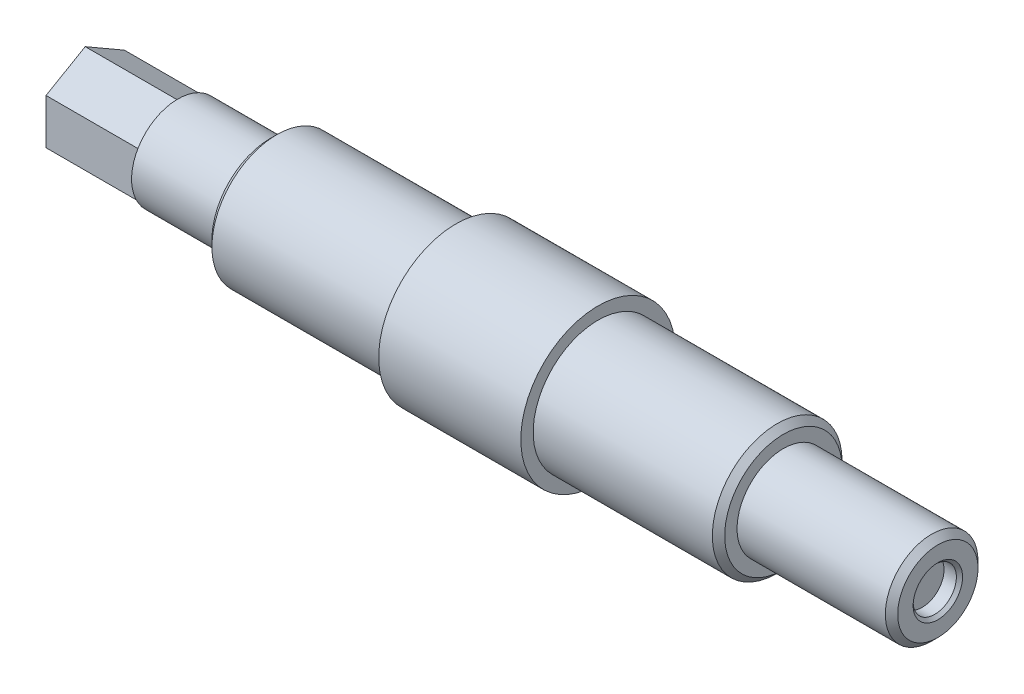
ISO-10303-21;
HEADER;
FILE_DESCRIPTION(('STEP AP214'),'2;1');
FILE_NAME('part.step','',(''),(''),'','','');
FILE_SCHEMA(('AUTOMOTIVE_DESIGN { 1 0 10303 214 1 1 1 1 }'));
ENDSEC;
DATA;
#1=APPLICATION_CONTEXT('core data for automotive mechanical design processes');
#2=APPLICATION_PROTOCOL_DEFINITION('international standard','automotive_design',2000,#1);
#3=PRODUCT_CONTEXT('',#1,'mechanical');
#4=PRODUCT('Part','Part','',(#3));
#5=PRODUCT_RELATED_PRODUCT_CATEGORY('part','',(#4));
#6=PRODUCT_DEFINITION_FORMATION('','',#4);
#7=PRODUCT_DEFINITION_CONTEXT('part definition',#1,'design');
#8=PRODUCT_DEFINITION('design','',#6,#7);
#9=PRODUCT_DEFINITION_SHAPE('','',#8);
#10=(LENGTH_UNIT() NAMED_UNIT(*) SI_UNIT(.MILLI.,.METRE.));
#11=(NAMED_UNIT(*) PLANE_ANGLE_UNIT() SI_UNIT($,.RADIAN.));
#12=(NAMED_UNIT(*) SI_UNIT($,.STERADIAN.) SOLID_ANGLE_UNIT());
#13=UNCERTAINTY_MEASURE_WITH_UNIT(LENGTH_MEASURE(1.E-05),#10,'distance_accuracy_value','');
#14=(GEOMETRIC_REPRESENTATION_CONTEXT(3) GLOBAL_UNCERTAINTY_ASSIGNED_CONTEXT((#13)) GLOBAL_UNIT_ASSIGNED_CONTEXT((#10,
#11,#12)) REPRESENTATION_CONTEXT('',''));
#15=CARTESIAN_POINT('',(0.,0.,0.));
#16=DIRECTION('',(0.,0.,1.));
#17=DIRECTION('',(1.,0.,0.));
#18=AXIS2_PLACEMENT_3D('',#15,#16,#17);
#19=CARTESIAN_POINT('',(15.,-3.66617420935414,6.34999999999999));
#20=DIRECTION('',(0.,0.86602540378444,-0.499999999999998));
#21=DIRECTION('',(0.,0.499999999999998,0.86602540378444));
#22=AXIS2_PLACEMENT_3D('',#19,#20,#21);
#23=PLANE('',#22);
#24=DIRECTION('',(0.,-0.499999999999998,-0.86602540378444));
#25=VECTOR('',#24,1.);
#26=CARTESIAN_POINT('',(0.,-3.66617420935414,6.34999999999999));
#27=LINE('',#26,#25);
#28=CARTESIAN_POINT('',(0.,-3.66617420935414,6.34999999999999));
#29=VERTEX_POINT('',#28);
#30=CARTESIAN_POINT('',(0.,-7.33234841870825,0.));
#31=VERTEX_POINT('',#30);
#32=EDGE_CURVE('E150',#29,#31,#27,.T.);
#33=ORIENTED_EDGE('',*,*,#32,.T.);
#34=DIRECTION('',(-1.,0.,0.));
#35=VECTOR('',#34,1.);
#36=CARTESIAN_POINT('',(15.,-7.33234841870825,0.));
#37=LINE('',#36,#35);
#38=CARTESIAN_POINT('',(15.,-7.33234841870825,0.));
#39=VERTEX_POINT('',#38);
#40=EDGE_CURVE('E175',#39,#31,#37,.T.);
#41=ORIENTED_EDGE('',*,*,#40,.F.);
#42=DIRECTION('',(0.,-0.499999999999998,-0.86602540378444));
#43=VECTOR('',#42,1.);
#44=CARTESIAN_POINT('',(15.,-3.66617420935414,6.34999999999999));
#45=LINE('',#44,#43);
#46=CARTESIAN_POINT('',(15.,-3.66617420935414,6.34999999999999));
#47=VERTEX_POINT('',#46);
#48=EDGE_CURVE('E140',#47,#39,#45,.T.);
#49=ORIENTED_EDGE('',*,*,#48,.F.);
#50=DIRECTION('',(-1.,0.,0.));
#51=VECTOR('',#50,1.);
#52=CARTESIAN_POINT('',(15.,-3.66617420935414,6.34999999999999));
#53=LINE('',#52,#51);
#54=EDGE_CURVE('E149',#47,#29,#53,.T.);
#55=ORIENTED_EDGE('',*,*,#54,.T.);
#56=EDGE_LOOP('',(#33,#41,#49,#55));
#57=FACE_BOUND('',#56,.T.);
#58=ADVANCED_FACE('F47',(#57),#23,.F.);
#59=CARTESIAN_POINT('',(15.,-7.33234841870825,0.));
#60=DIRECTION('',(0.,0.866025403784437,0.500000000000002));
#61=DIRECTION('',(0.,-0.500000000000002,0.866025403784437));
#62=AXIS2_PLACEMENT_3D('',#59,#60,#61);
#63=PLANE('',#62);
#64=DIRECTION('',(0.,0.500000000000002,-0.866025403784437));
#65=VECTOR('',#64,1.);
#66=CARTESIAN_POINT('',(0.,-7.33234841870825,0.));
#67=LINE('',#66,#65);
#68=CARTESIAN_POINT('',(0.,-3.66617420935411,-6.35000000000001));
#69=VERTEX_POINT('',#68);
#70=EDGE_CURVE('E154',#31,#69,#67,.T.);
#71=ORIENTED_EDGE('',*,*,#70,.T.);
#72=DIRECTION('',(-1.,0.,0.));
#73=VECTOR('',#72,1.);
#74=CARTESIAN_POINT('',(15.,-3.66617420935411,-6.35000000000001));
#75=LINE('',#74,#73);
#76=CARTESIAN_POINT('',(15.,-3.66617420935411,-6.35000000000001));
#77=VERTEX_POINT('',#76);
#78=EDGE_CURVE('E123',#77,#69,#75,.T.);
#79=ORIENTED_EDGE('',*,*,#78,.F.);
#80=DIRECTION('',(0.,0.500000000000002,-0.866025403784437));
#81=VECTOR('',#80,1.);
#82=CARTESIAN_POINT('',(15.,-7.33234841870825,0.));
#83=LINE('',#82,#81);
#84=EDGE_CURVE('E103',#39,#77,#83,.T.);
#85=ORIENTED_EDGE('',*,*,#84,.F.);
#86=ORIENTED_EDGE('',*,*,#40,.T.);
#87=EDGE_LOOP('',(#71,#79,#85,#86));
#88=FACE_BOUND('',#87,.T.);
#89=ADVANCED_FACE('F220',(#88),#63,.F.);
#90=CARTESIAN_POINT('',(15.,-3.66617420935411,-6.35000000000001));
#91=DIRECTION('',(0.,0.,1.));
#92=DIRECTION('',(0.,-1.,0.));
#93=AXIS2_PLACEMENT_3D('',#90,#91,#92);
#94=PLANE('',#93);
#95=DIRECTION('',(0.,1.,0.));
#96=VECTOR('',#95,1.);
#97=CARTESIAN_POINT('',(0.,-3.66617420935411,-6.35000000000001));
#98=LINE('',#97,#96);
#99=CARTESIAN_POINT('',(0.,3.66617420935413,-6.34999999999999));
#100=VERTEX_POINT('',#99);
#101=EDGE_CURVE('E119',#69,#100,#98,.T.);
#102=ORIENTED_EDGE('',*,*,#101,.T.);
#103=DIRECTION('',(-1.,0.,0.));
#104=VECTOR('',#103,1.);
#105=CARTESIAN_POINT('',(15.,3.66617420935413,-6.34999999999999));
#106=LINE('',#105,#104);
#107=CARTESIAN_POINT('',(15.,3.66617420935413,-6.34999999999999));
#108=VERTEX_POINT('',#107);
#109=EDGE_CURVE('E112',#108,#100,#106,.T.);
#110=ORIENTED_EDGE('',*,*,#109,.F.);
#111=DIRECTION('',(0.,1.,0.));
#112=VECTOR('',#111,1.);
#113=CARTESIAN_POINT('',(15.,-3.66617420935411,-6.35000000000001));
#114=LINE('',#113,#112);
#115=EDGE_CURVE('E117',#77,#108,#114,.T.);
#116=ORIENTED_EDGE('',*,*,#115,.F.);
#117=ORIENTED_EDGE('',*,*,#78,.T.);
#118=EDGE_LOOP('',(#102,#110,#116,#117));
#119=FACE_BOUND('',#118,.T.);
#120=ADVANCED_FACE('F114',(#119),#94,.F.);
#121=CARTESIAN_POINT('',(15.,3.66617420935413,-6.34999999999999));
#122=DIRECTION('',(0.,-0.86602540378444,0.499999999999998));
#123=DIRECTION('',(0.,-0.499999999999998,-0.86602540378444));
#124=AXIS2_PLACEMENT_3D('',#121,#122,#123);
#125=PLANE('',#124);
#126=DIRECTION('',(0.,0.499999999999998,0.86602540378444));
#127=VECTOR('',#126,1.);
#128=CARTESIAN_POINT('',(0.,3.66617420935413,-6.34999999999999));
#129=LINE('',#128,#127);
#130=CARTESIAN_POINT('',(0.,7.33234841870825,0.));
#131=VERTEX_POINT('',#130);
#132=EDGE_CURVE('E160',#100,#131,#129,.T.);
#133=ORIENTED_EDGE('',*,*,#132,.T.);
#134=DIRECTION('',(-1.,0.,0.));
#135=VECTOR('',#134,1.);
#136=CARTESIAN_POINT('',(15.,7.33234841870825,0.));
#137=LINE('',#136,#135);
#138=CARTESIAN_POINT('',(15.,7.33234841870825,0.));
#139=VERTEX_POINT('',#138);
#140=EDGE_CURVE('E124',#139,#131,#137,.T.);
#141=ORIENTED_EDGE('',*,*,#140,.F.);
#142=DIRECTION('',(0.,0.499999999999998,0.86602540378444));
#143=VECTOR('',#142,1.);
#144=CARTESIAN_POINT('',(15.,3.66617420935413,-6.34999999999999));
#145=LINE('',#144,#143);
#146=EDGE_CURVE('E127',#108,#139,#145,.T.);
#147=ORIENTED_EDGE('',*,*,#146,.F.);
#148=ORIENTED_EDGE('',*,*,#109,.T.);
#149=EDGE_LOOP('',(#133,#141,#147,#148));
#150=FACE_BOUND('',#149,.T.);
#151=ADVANCED_FACE('F128',(#150),#125,.F.);
#152=CARTESIAN_POINT('',(15.,7.33234841870825,0.));
#153=DIRECTION('',(0.,-0.866025403784437,-0.500000000000002));
#154=DIRECTION('',(0.,0.500000000000002,-0.866025403784438));
#155=AXIS2_PLACEMENT_3D('',#152,#153,#154);
#156=PLANE('',#155);
#157=DIRECTION('',(0.,-0.500000000000002,0.866025403784438));
#158=VECTOR('',#157,1.);
#159=CARTESIAN_POINT('',(0.,7.33234841870825,0.));
#160=LINE('',#159,#158);
#161=CARTESIAN_POINT('',(0.,3.66617420935411,6.35000000000001));
#162=VERTEX_POINT('',#161);
#163=EDGE_CURVE('E88',#131,#162,#160,.T.);
#164=ORIENTED_EDGE('',*,*,#163,.T.);
#165=DIRECTION('',(-1.,0.,0.));
#166=VECTOR('',#165,1.);
#167=CARTESIAN_POINT('',(15.,3.66617420935411,6.35000000000001));
#168=LINE('',#167,#166);
#169=CARTESIAN_POINT('',(15.,3.66617420935411,6.35000000000001));
#170=VERTEX_POINT('',#169);
#171=EDGE_CURVE('E66',#170,#162,#168,.T.);
#172=ORIENTED_EDGE('',*,*,#171,.F.);
#173=DIRECTION('',(0.,-0.500000000000002,0.866025403784438));
#174=VECTOR('',#173,1.);
#175=CARTESIAN_POINT('',(15.,7.33234841870825,0.));
#176=LINE('',#175,#174);
#177=EDGE_CURVE('E132',#139,#170,#176,.T.);
#178=ORIENTED_EDGE('',*,*,#177,.F.);
#179=ORIENTED_EDGE('',*,*,#140,.T.);
#180=EDGE_LOOP('',(#164,#172,#178,#179));
#181=FACE_BOUND('',#180,.T.);
#182=ADVANCED_FACE('F308',(#181),#156,.F.);
#183=CARTESIAN_POINT('',(15.,3.66617420935411,6.35000000000001));
#184=DIRECTION('',(0.,0.,-1.));
#185=DIRECTION('',(0.,1.,0.));
#186=AXIS2_PLACEMENT_3D('',#183,#184,#185);
#187=PLANE('',#186);
#188=DIRECTION('',(0.,-1.,0.));
#189=VECTOR('',#188,1.);
#190=CARTESIAN_POINT('',(0.,3.66617420935411,6.35000000000001));
#191=LINE('',#190,#189);
#192=EDGE_CURVE('E94',#162,#29,#191,.T.);
#193=ORIENTED_EDGE('',*,*,#192,.T.);
#194=ORIENTED_EDGE('',*,*,#54,.F.);
#195=DIRECTION('',(0.,-1.,0.));
#196=VECTOR('',#195,1.);
#197=CARTESIAN_POINT('',(15.,3.66617420935411,6.35000000000001));
#198=LINE('',#197,#196);
#199=EDGE_CURVE('E146',#170,#47,#198,.T.);
#200=ORIENTED_EDGE('',*,*,#199,.F.);
#201=ORIENTED_EDGE('',*,*,#171,.T.);
#202=EDGE_LOOP('',(#193,#194,#200,#201));
#203=FACE_BOUND('',#202,.T.);
#204=ADVANCED_FACE('F307',(#203),#187,.F.);
#205=CARTESIAN_POINT('',(0.,0.,0.));
#206=DIRECTION('',(1.,0.,0.));
#207=DIRECTION('',(0.,0.,-1.));
#208=AXIS2_PLACEMENT_3D('',#205,#206,#207);
#209=PLANE('',#208);
#210=CARTESIAN_POINT('',(0.,0.,0.));
#211=DIRECTION('',(-1.,0.,0.));
#212=DIRECTION('',(0.,0.,1.));
#213=AXIS2_PLACEMENT_3D('',#210,#211,#212);
#214=CIRCLE('',#213,2.1);
#215=CARTESIAN_POINT('',(0.,0.,2.1));
#216=VERTEX_POINT('',#215);
#217=EDGE_CURVE('E294',#216,#216,#214,.T.);
#218=ORIENTED_EDGE('',*,*,#217,.F.);
#219=EDGE_LOOP('',(#218));
#220=FACE_BOUND('',#219,.T.);
#221=ORIENTED_EDGE('',*,*,#32,.F.);
#222=ORIENTED_EDGE('',*,*,#192,.F.);
#223=ORIENTED_EDGE('',*,*,#163,.F.);
#224=ORIENTED_EDGE('',*,*,#132,.F.);
#225=ORIENTED_EDGE('',*,*,#101,.F.);
#226=ORIENTED_EDGE('',*,*,#70,.F.);
#227=EDGE_LOOP('',(#221,#222,#223,#224,#225,#226));
#228=FACE_BOUND('',#227,.T.);
#229=ADVANCED_FACE('F310',(#220,#228),#209,.F.);
#230=CARTESIAN_POINT('',(12.4,0.,0.));
#231=DIRECTION('',(-1.,0.,0.));
#232=DIRECTION('',(0.,0.,1.));
#233=AXIS2_PLACEMENT_3D('',#230,#231,#232);
#234=CONICAL_SURFACE('',#233,2.1,1.02974425867665);
#235=CARTESIAN_POINT('',(13.6618072999579,0.,0.));
#236=VERTEX_POINT('',#235);
#237=VERTEX_LOOP('',#236);
#238=FACE_BOUND('',#237,.T.);
#239=CARTESIAN_POINT('',(12.4,0.,0.));
#240=DIRECTION('',(-1.,0.,0.));
#241=DIRECTION('',(0.,0.,1.));
#242=AXIS2_PLACEMENT_3D('',#239,#240,#241);
#243=CIRCLE('',#242,2.1);
#244=CARTESIAN_POINT('',(12.4,0.,2.1));
#245=VERTEX_POINT('',#244);
#246=EDGE_CURVE('E155',#245,#245,#243,.T.);
#247=ORIENTED_EDGE('',*,*,#246,.T.);
#248=EDGE_LOOP('',(#247));
#249=FACE_BOUND('',#248,.T.);
#250=ADVANCED_FACE('F312',(#238,#249),#234,.F.);
#251=CARTESIAN_POINT('',(0.,0.,0.));
#252=DIRECTION('',(-1.,0.,0.));
#253=DIRECTION('',(0.,0.,1.));
#254=AXIS2_PLACEMENT_3D('',#251,#252,#253);
#255=CYLINDRICAL_SURFACE('',#254,2.1);
#256=ORIENTED_EDGE('',*,*,#246,.F.);
#257=EDGE_LOOP('',(#256));
#258=FACE_BOUND('',#257,.T.);
#259=ORIENTED_EDGE('',*,*,#217,.T.);
#260=EDGE_LOOP('',(#259));
#261=FACE_BOUND('',#260,.T.);
#262=ADVANCED_FACE('F319',(#258,#261),#255,.F.);
#263=CARTESIAN_POINT('',(15.,0.,0.));
#264=DIRECTION('',(1.,0.,0.));
#265=DIRECTION('',(0.,0.,-1.));
#266=AXIS2_PLACEMENT_3D('',#263,#264,#265);
#267=PLANE('',#266);
#268=CARTESIAN_POINT('',(15.,0.,0.));
#269=DIRECTION('',(1.,0.,0.));
#270=DIRECTION('',(0.,0.,-1.));
#271=AXIS2_PLACEMENT_3D('',#268,#269,#270);
#272=CIRCLE('',#271,7.5);
#273=CARTESIAN_POINT('',(15.,0.,-7.5));
#274=VERTEX_POINT('',#273);
#275=EDGE_CURVE('E289',#274,#274,#272,.T.);
#276=ORIENTED_EDGE('',*,*,#275,.F.);
#277=EDGE_LOOP('',(#276));
#278=FACE_BOUND('',#277,.T.);
#279=ORIENTED_EDGE('',*,*,#199,.T.);
#280=ORIENTED_EDGE('',*,*,#48,.T.);
#281=ORIENTED_EDGE('',*,*,#84,.T.);
#282=ORIENTED_EDGE('',*,*,#115,.T.);
#283=ORIENTED_EDGE('',*,*,#146,.T.);
#284=ORIENTED_EDGE('',*,*,#177,.T.);
#285=EDGE_LOOP('',(#279,#280,#281,#282,#283,#284));
#286=FACE_BOUND('',#285,.T.);
#287=ADVANCED_FACE('F135',(#278,#286),#267,.F.);
#288=CARTESIAN_POINT('',(30.,0.,0.));
#289=DIRECTION('',(-1.,0.,0.));
#290=DIRECTION('',(0.,0.,1.));
#291=AXIS2_PLACEMENT_3D('',#288,#289,#290);
#292=CYLINDRICAL_SURFACE('',#291,7.5);
#293=CARTESIAN_POINT('',(30.,0.,0.));
#294=DIRECTION('',(1.,0.,0.));
#295=DIRECTION('',(0.,0.,-1.));
#296=AXIS2_PLACEMENT_3D('',#293,#294,#295);
#297=CIRCLE('',#296,7.5);
#298=CARTESIAN_POINT('',(30.,0.,-7.5));
#299=VERTEX_POINT('',#298);
#300=EDGE_CURVE('E290',#299,#299,#297,.T.);
#301=ORIENTED_EDGE('',*,*,#300,.F.);
#302=EDGE_LOOP('',(#301));
#303=FACE_BOUND('',#302,.T.);
#304=ORIENTED_EDGE('',*,*,#275,.T.);
#305=EDGE_LOOP('',(#304));
#306=FACE_BOUND('',#305,.T.);
#307=ADVANCED_FACE('F356',(#303,#306),#292,.T.);
#308=CARTESIAN_POINT('',(60.,0.,0.));
#309=DIRECTION('',(-1.,0.,0.));
#310=DIRECTION('',(0.,0.,1.));
#311=AXIS2_PLACEMENT_3D('',#308,#309,#310);
#312=CYLINDRICAL_SURFACE('',#311,10.5);
#313=CARTESIAN_POINT('',(31.,0.,0.));
#314=DIRECTION('',(1.,0.,0.));
#315=DIRECTION('',(0.,0.,-1.));
#316=AXIS2_PLACEMENT_3D('',#313,#314,#315);
#317=CIRCLE('',#316,10.5);
#318=CARTESIAN_POINT('',(31.,0.,-10.5));
#319=VERTEX_POINT('',#318);
#320=EDGE_CURVE('E179',#319,#319,#317,.T.);
#321=ORIENTED_EDGE('',*,*,#320,.T.);
#322=EDGE_LOOP('',(#321));
#323=FACE_BOUND('',#322,.T.);
#324=CARTESIAN_POINT('',(60.,0.,0.));
#325=DIRECTION('',(1.,0.,0.));
#326=DIRECTION('',(0.,0.,-1.));
#327=AXIS2_PLACEMENT_3D('',#324,#325,#326);
#328=CIRCLE('',#327,10.5);
#329=CARTESIAN_POINT('',(60.,0.,-10.5));
#330=VERTEX_POINT('',#329);
#331=EDGE_CURVE('E281',#330,#330,#328,.T.);
#332=ORIENTED_EDGE('',*,*,#331,.F.);
#333=EDGE_LOOP('',(#332));
#334=FACE_BOUND('',#333,.T.);
#335=ADVANCED_FACE('F368',(#323,#334),#312,.T.);
#336=CARTESIAN_POINT('',(30.,0.,0.));
#337=DIRECTION('',(1.,0.,0.));
#338=DIRECTION('',(0.,0.,-1.));
#339=AXIS2_PLACEMENT_3D('',#336,#337,#338);
#340=PLANE('',#339);
#341=CARTESIAN_POINT('',(30.,0.,0.));
#342=DIRECTION('',(1.,0.,0.));
#343=DIRECTION('',(0.,0.,-1.));
#344=AXIS2_PLACEMENT_3D('',#341,#342,#343);
#345=CIRCLE('',#344,9.49999999999998);
#346=CARTESIAN_POINT('',(30.,0.,-9.49999999999998));
#347=VERTEX_POINT('',#346);
#348=EDGE_CURVE('E183',#347,#347,#345,.F.);
#349=ORIENTED_EDGE('',*,*,#348,.T.);
#350=EDGE_LOOP('',(#349));
#351=FACE_BOUND('',#350,.T.);
#352=ORIENTED_EDGE('',*,*,#300,.T.);
#353=EDGE_LOOP('',(#352));
#354=FACE_BOUND('',#353,.T.);
#355=ADVANCED_FACE('F382',(#351,#354),#340,.F.);
#356=CARTESIAN_POINT('',(83.,0.,0.));
#357=DIRECTION('',(-1.,0.,0.));
#358=DIRECTION('',(0.,0.,1.));
#359=AXIS2_PLACEMENT_3D('',#356,#357,#358);
#360=CYLINDRICAL_SURFACE('',#359,12.5);
#361=CARTESIAN_POINT('',(83.,0.,0.));
#362=DIRECTION('',(1.,0.,0.));
#363=DIRECTION('',(0.,0.,-1.));
#364=AXIS2_PLACEMENT_3D('',#361,#362,#363);
#365=CIRCLE('',#364,12.5);
#366=CARTESIAN_POINT('',(83.,0.,-12.5));
#367=VERTEX_POINT('',#366);
#368=EDGE_CURVE('E277',#367,#367,#365,.T.);
#369=ORIENTED_EDGE('',*,*,#368,.F.);
#370=EDGE_LOOP('',(#369));
#371=FACE_BOUND('',#370,.T.);
#372=CARTESIAN_POINT('',(60.,0.,0.));
#373=DIRECTION('',(1.,0.,0.));
#374=DIRECTION('',(0.,0.,-1.));
#375=AXIS2_PLACEMENT_3D('',#372,#373,#374);
#376=CIRCLE('',#375,12.5);
#377=CARTESIAN_POINT('',(60.,0.,-12.5));
#378=VERTEX_POINT('',#377);
#379=EDGE_CURVE('E282',#378,#378,#376,.T.);
#380=ORIENTED_EDGE('',*,*,#379,.T.);
#381=EDGE_LOOP('',(#380));
#382=FACE_BOUND('',#381,.T.);
#383=ADVANCED_FACE('F376',(#371,#382),#360,.T.);
#384=CARTESIAN_POINT('',(83.,0.,0.));
#385=DIRECTION('',(1.,0.,0.));
#386=DIRECTION('',(0.,0.,-1.));
#387=AXIS2_PLACEMENT_3D('',#384,#385,#386);
#388=PLANE('',#387);
#389=CARTESIAN_POINT('',(83.,0.,0.));
#390=DIRECTION('',(1.,0.,0.));
#391=DIRECTION('',(0.,0.,-1.));
#392=AXIS2_PLACEMENT_3D('',#389,#390,#391);
#393=CIRCLE('',#392,10.5);
#394=CARTESIAN_POINT('',(83.,0.,-10.5));
#395=VERTEX_POINT('',#394);
#396=EDGE_CURVE('E178',#395,#395,#393,.T.);
#397=ORIENTED_EDGE('',*,*,#396,.F.);
#398=EDGE_LOOP('',(#397));
#399=FACE_BOUND('',#398,.T.);
#400=ORIENTED_EDGE('',*,*,#368,.T.);
#401=EDGE_LOOP('',(#400));
#402=FACE_BOUND('',#401,.T.);
#403=ADVANCED_FACE('F381',(#399,#402),#388,.T.);
#404=CARTESIAN_POINT('',(60.,0.,0.));
#405=DIRECTION('',(1.,0.,0.));
#406=DIRECTION('',(0.,0.,-1.));
#407=AXIS2_PLACEMENT_3D('',#404,#405,#406);
#408=PLANE('',#407);
#409=ORIENTED_EDGE('',*,*,#331,.T.);
#410=EDGE_LOOP('',(#409));
#411=FACE_BOUND('',#410,.T.);
#412=ORIENTED_EDGE('',*,*,#379,.F.);
#413=EDGE_LOOP('',(#412));
#414=FACE_BOUND('',#413,.T.);
#415=ADVANCED_FACE('F392',(#411,#414),#408,.F.);
#416=CARTESIAN_POINT('',(113.,0.,0.));
#417=DIRECTION('',(-1.,0.,0.));
#418=DIRECTION('',(0.,0.,1.));
#419=AXIS2_PLACEMENT_3D('',#416,#417,#418);
#420=CYLINDRICAL_SURFACE('',#419,10.5);
#421=CARTESIAN_POINT('',(112.,0.,0.));
#422=DIRECTION('',(1.,0.,0.));
#423=DIRECTION('',(0.,0.,-1.));
#424=AXIS2_PLACEMENT_3D('',#421,#422,#423);
#425=CIRCLE('',#424,10.5);
#426=CARTESIAN_POINT('',(112.,0.,-10.5));
#427=VERTEX_POINT('',#426);
#428=EDGE_CURVE('E191',#427,#427,#425,.F.);
#429=ORIENTED_EDGE('',*,*,#428,.T.);
#430=EDGE_LOOP('',(#429));
#431=FACE_BOUND('',#430,.T.);
#432=ORIENTED_EDGE('',*,*,#396,.T.);
#433=EDGE_LOOP('',(#432));
#434=FACE_BOUND('',#433,.T.);
#435=ADVANCED_FACE('F397',(#431,#434),#420,.T.);
#436=CARTESIAN_POINT('',(113.,0.,0.));
#437=DIRECTION('',(1.,0.,0.));
#438=DIRECTION('',(0.,0.,-1.));
#439=AXIS2_PLACEMENT_3D('',#436,#437,#438);
#440=PLANE('',#439);
#441=CARTESIAN_POINT('',(113.,0.,0.));
#442=DIRECTION('',(1.,0.,0.));
#443=DIRECTION('',(0.,0.,-1.));
#444=AXIS2_PLACEMENT_3D('',#441,#442,#443);
#445=CIRCLE('',#444,7.5);
#446=CARTESIAN_POINT('',(113.,0.,-7.5));
#447=VERTEX_POINT('',#446);
#448=EDGE_CURVE('E195',#447,#447,#445,.T.);
#449=ORIENTED_EDGE('',*,*,#448,.F.);
#450=EDGE_LOOP('',(#449));
#451=FACE_BOUND('',#450,.T.);
#452=CARTESIAN_POINT('',(113.,0.,0.));
#453=DIRECTION('',(1.,0.,0.));
#454=DIRECTION('',(0.,0.,-1.));
#455=AXIS2_PLACEMENT_3D('',#452,#453,#454);
#456=CIRCLE('',#455,9.49999999999999);
#457=CARTESIAN_POINT('',(113.,0.,-9.49999999999999));
#458=VERTEX_POINT('',#457);
#459=EDGE_CURVE('E187',#458,#458,#456,.T.);
#460=ORIENTED_EDGE('',*,*,#459,.T.);
#461=EDGE_LOOP('',(#460));
#462=FACE_BOUND('',#461,.T.);
#463=ADVANCED_FACE('F237',(#451,#462),#440,.T.);
#464=CARTESIAN_POINT('',(31.,0.,0.));
#465=DIRECTION('',(1.,0.,0.));
#466=DIRECTION('',(0.,0.,-1.));
#467=AXIS2_PLACEMENT_3D('',#464,#465,#466);
#468=CONICAL_SURFACE('',#467,10.5,0.785398163397447);
#469=ORIENTED_EDGE('',*,*,#348,.F.);
#470=EDGE_LOOP('',(#469));
#471=FACE_BOUND('',#470,.T.);
#472=ORIENTED_EDGE('',*,*,#320,.F.);
#473=EDGE_LOOP('',(#472));
#474=FACE_BOUND('',#473,.T.);
#475=ADVANCED_FACE('F230',(#471,#474),#468,.T.);
#476=CARTESIAN_POINT('',(113.,0.,0.));
#477=DIRECTION('',(-1.,0.,0.));
#478=DIRECTION('',(0.,0.,1.));
#479=AXIS2_PLACEMENT_3D('',#476,#477,#478);
#480=CONICAL_SURFACE('',#479,9.49999999999999,0.785398163397451);
#481=ORIENTED_EDGE('',*,*,#428,.F.);
#482=EDGE_LOOP('',(#481));
#483=FACE_BOUND('',#482,.T.);
#484=ORIENTED_EDGE('',*,*,#459,.F.);
#485=EDGE_LOOP('',(#484));
#486=FACE_BOUND('',#485,.T.);
#487=ADVANCED_FACE('F236',(#483,#486),#480,.T.);
#488=CARTESIAN_POINT('',(138.,0.,0.));
#489=DIRECTION('',(-1.,0.,0.));
#490=DIRECTION('',(0.,0.,1.));
#491=AXIS2_PLACEMENT_3D('',#488,#489,#490);
#492=CYLINDRICAL_SURFACE('',#491,7.5);
#493=CARTESIAN_POINT('',(137.,0.,0.));
#494=DIRECTION('',(1.,0.,0.));
#495=DIRECTION('',(0.,0.,-1.));
#496=AXIS2_PLACEMENT_3D('',#493,#494,#495);
#497=CIRCLE('',#496,7.5);
#498=CARTESIAN_POINT('',(137.,0.,-7.5));
#499=VERTEX_POINT('',#498);
#500=EDGE_CURVE('E200',#499,#499,#497,.F.);
#501=ORIENTED_EDGE('',*,*,#500,.T.);
#502=EDGE_LOOP('',(#501));
#503=FACE_BOUND('',#502,.T.);
#504=ORIENTED_EDGE('',*,*,#448,.T.);
#505=EDGE_LOOP('',(#504));
#506=FACE_BOUND('',#505,.T.);
#507=ADVANCED_FACE('F243',(#503,#506),#492,.T.);
#508=CARTESIAN_POINT('',(138.,0.,0.));
#509=DIRECTION('',(1.,0.,0.));
#510=DIRECTION('',(0.,0.,-1.));
#511=AXIS2_PLACEMENT_3D('',#508,#509,#510);
#512=PLANE('',#511);
#513=CARTESIAN_POINT('',(138.,0.,0.));
#514=DIRECTION('',(1.,0.,0.));
#515=DIRECTION('',(0.,0.,-1.));
#516=AXIS2_PLACEMENT_3D('',#513,#514,#515);
#517=CIRCLE('',#516,4.00000000000002);
#518=CARTESIAN_POINT('',(138.,0.,-4.00000000000002));
#519=VERTEX_POINT('',#518);
#520=EDGE_CURVE('E11',#519,#519,#517,.F.);
#521=ORIENTED_EDGE('',*,*,#520,.T.);
#522=EDGE_LOOP('',(#521));
#523=FACE_BOUND('',#522,.T.);
#524=CARTESIAN_POINT('',(138.,0.,0.));
#525=DIRECTION('',(1.,0.,0.));
#526=DIRECTION('',(0.,0.,-1.));
#527=AXIS2_PLACEMENT_3D('',#524,#525,#526);
#528=CIRCLE('',#527,6.50000000000001);
#529=CARTESIAN_POINT('',(138.,0.,-6.50000000000001));
#530=VERTEX_POINT('',#529);
#531=EDGE_CURVE('E196',#530,#530,#528,.T.);
#532=ORIENTED_EDGE('',*,*,#531,.T.);
#533=EDGE_LOOP('',(#532));
#534=FACE_BOUND('',#533,.T.);
#535=ADVANCED_FACE('F249',(#523,#534),#512,.T.);
#536=CARTESIAN_POINT('',(138.,0.,0.));
#537=DIRECTION('',(-1.,0.,0.));
#538=DIRECTION('',(0.,0.,1.));
#539=AXIS2_PLACEMENT_3D('',#536,#537,#538);
#540=CONICAL_SURFACE('',#539,6.50000000000001,0.785398163397445);
#541=ORIENTED_EDGE('',*,*,#500,.F.);
#542=EDGE_LOOP('',(#541));
#543=FACE_BOUND('',#542,.T.);
#544=ORIENTED_EDGE('',*,*,#531,.F.);
#545=EDGE_LOOP('',(#544));
#546=FACE_BOUND('',#545,.T.);
#547=ADVANCED_FACE('F245',(#543,#546),#540,.T.);
#548=CARTESIAN_POINT('',(135.5,0.,0.));
#549=DIRECTION('',(1.,0.,0.));
#550=DIRECTION('',(0.,0.,-1.));
#551=AXIS2_PLACEMENT_3D('',#548,#549,#550);
#552=CYLINDRICAL_SURFACE('',#551,3.5);
#553=CARTESIAN_POINT('',(137.5,0.,0.));
#554=DIRECTION('',(1.,0.,0.));
#555=DIRECTION('',(0.,0.,-1.));
#556=AXIS2_PLACEMENT_3D('',#553,#554,#555);
#557=CIRCLE('',#556,3.5);
#558=CARTESIAN_POINT('',(137.5,0.,-3.5));
#559=VERTEX_POINT('',#558);
#560=EDGE_CURVE('E58',#559,#559,#557,.T.);
#561=ORIENTED_EDGE('',*,*,#560,.T.);
#562=EDGE_LOOP('',(#561));
#563=FACE_BOUND('',#562,.T.);
#564=CARTESIAN_POINT('',(135.5,0.,0.));
#565=DIRECTION('',(1.,0.,0.));
#566=DIRECTION('',(0.,0.,-1.));
#567=AXIS2_PLACEMENT_3D('',#564,#565,#566);
#568=CIRCLE('',#567,3.5);
#569=CARTESIAN_POINT('',(135.5,0.,-3.5));
#570=VERTEX_POINT('',#569);
#571=EDGE_CURVE('E273',#570,#570,#568,.T.);
#572=ORIENTED_EDGE('',*,*,#571,.F.);
#573=EDGE_LOOP('',(#572));
#574=FACE_BOUND('',#573,.T.);
#575=ADVANCED_FACE('F207',(#563,#574),#552,.F.);
#576=CARTESIAN_POINT('',(135.5,0.,0.));
#577=DIRECTION('',(1.,0.,0.));
#578=DIRECTION('',(0.,0.,-1.));
#579=AXIS2_PLACEMENT_3D('',#576,#577,#578);
#580=PLANE('',#579);
#581=ORIENTED_EDGE('',*,*,#571,.T.);
#582=EDGE_LOOP('',(#581));
#583=FACE_BOUND('',#582,.T.);
#584=ADVANCED_FACE('F211',(#583),#580,.T.);
#585=CARTESIAN_POINT('',(137.5,0.,0.));
#586=DIRECTION('',(1.,0.,0.));
#587=DIRECTION('',(0.,0.,-1.));
#588=AXIS2_PLACEMENT_3D('',#585,#586,#587);
#589=CONICAL_SURFACE('',#588,3.5,0.785398163397438);
#590=ORIENTED_EDGE('',*,*,#520,.F.);
#591=EDGE_LOOP('',(#590));
#592=FACE_BOUND('',#591,.T.);
#593=ORIENTED_EDGE('',*,*,#560,.F.);
#594=EDGE_LOOP('',(#593));
#595=FACE_BOUND('',#594,.T.);
#596=ADVANCED_FACE('F50',(#592,#595),#589,.F.);
#597=CLOSED_SHELL('',(#58,#89,#120,#151,#182,#204,#229,#250,#262,#287,#307,#335,#355,#383,#403,
#415,#435,#463,#475,#487,#507,#535,#547,#575,#584,#596));
#598=MANIFOLD_SOLID_BREP('B2',#597);
#599=ADVANCED_BREP_SHAPE_REPRESENTATION('',(#18,#598),#14);
#600=SHAPE_DEFINITION_REPRESENTATION(#9,#599);
ENDSEC;
END-ISO-10303-21;
